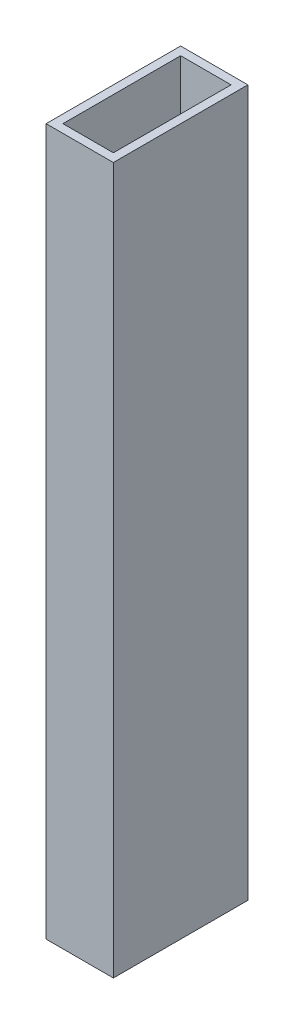
ISO-10303-21;
HEADER;
FILE_DESCRIPTION(('STEP AP214'),'2;1');
FILE_NAME('part.step','',(''),(''),'','','');
FILE_SCHEMA(('AUTOMOTIVE_DESIGN { 1 0 10303 214 1 1 1 1 }'));
ENDSEC;
DATA;
#1=APPLICATION_CONTEXT('core data for automotive mechanical design processes');
#2=APPLICATION_PROTOCOL_DEFINITION('international standard','automotive_design',2000,#1);
#3=PRODUCT_CONTEXT('',#1,'mechanical');
#4=PRODUCT('Part','Part','',(#3));
#5=PRODUCT_RELATED_PRODUCT_CATEGORY('part','',(#4));
#6=PRODUCT_DEFINITION_FORMATION('','',#4);
#7=PRODUCT_DEFINITION_CONTEXT('part definition',#1,'design');
#8=PRODUCT_DEFINITION('design','',#6,#7);
#9=PRODUCT_DEFINITION_SHAPE('','',#8);
#10=(LENGTH_UNIT() NAMED_UNIT(*) SI_UNIT(.MILLI.,.METRE.));
#11=(NAMED_UNIT(*) PLANE_ANGLE_UNIT() SI_UNIT($,.RADIAN.));
#12=(NAMED_UNIT(*) SI_UNIT($,.STERADIAN.) SOLID_ANGLE_UNIT());
#13=UNCERTAINTY_MEASURE_WITH_UNIT(LENGTH_MEASURE(1.E-05),#10,'distance_accuracy_value','');
#14=(GEOMETRIC_REPRESENTATION_CONTEXT(3) GLOBAL_UNCERTAINTY_ASSIGNED_CONTEXT((#13)) GLOBAL_UNIT_ASSIGNED_CONTEXT((#10,
#11,#12)) REPRESENTATION_CONTEXT('',''));
#15=CARTESIAN_POINT('',(0.,0.,0.));
#16=DIRECTION('',(0.,0.,1.));
#17=DIRECTION('',(1.,0.,0.));
#18=AXIS2_PLACEMENT_3D('',#15,#16,#17);
#19=CARTESIAN_POINT('',(0.,266.7,0.));
#20=DIRECTION('',(0.,-1.,0.));
#21=DIRECTION('',(0.,0.,-1.));
#22=AXIS2_PLACEMENT_3D('',#19,#20,#21);
#23=PLANE('',#22);
#24=DIRECTION('',(0.,0.,-1.));
#25=VECTOR('',#24,1.);
#26=CARTESIAN_POINT('',(12.7,266.7,25.4));
#27=LINE('',#26,#25);
#28=CARTESIAN_POINT('',(12.7,266.7,25.4));
#29=VERTEX_POINT('',#28);
#30=CARTESIAN_POINT('',(12.7,266.7,-25.4));
#31=VERTEX_POINT('',#30);
#32=EDGE_CURVE('E159',#29,#31,#27,.T.);
#33=ORIENTED_EDGE('',*,*,#32,.T.);
#34=DIRECTION('',(-1.,0.,0.));
#35=VECTOR('',#34,1.);
#36=CARTESIAN_POINT('',(-12.7,266.7,-25.4));
#37=LINE('',#36,#35);
#38=CARTESIAN_POINT('',(-12.7,266.7,-25.4));
#39=VERTEX_POINT('',#38);
#40=EDGE_CURVE('E163',#31,#39,#37,.T.);
#41=ORIENTED_EDGE('',*,*,#40,.T.);
#42=DIRECTION('',(0.,0.,1.));
#43=VECTOR('',#42,1.);
#44=CARTESIAN_POINT('',(-12.7,266.7,25.4));
#45=LINE('',#44,#43);
#46=CARTESIAN_POINT('',(-12.7,266.7,25.4));
#47=VERTEX_POINT('',#46);
#48=EDGE_CURVE('E167',#39,#47,#45,.T.);
#49=ORIENTED_EDGE('',*,*,#48,.T.);
#50=DIRECTION('',(1.,0.,0.));
#51=VECTOR('',#50,1.);
#52=CARTESIAN_POINT('',(-12.7,266.7,25.4));
#53=LINE('',#52,#51);
#54=EDGE_CURVE('E170',#47,#29,#53,.T.);
#55=ORIENTED_EDGE('',*,*,#54,.T.);
#56=EDGE_LOOP('',(#33,#41,#49,#55));
#57=FACE_BOUND('',#56,.T.);
#58=DIRECTION('',(0.,0.,1.));
#59=VECTOR('',#58,1.);
#60=CARTESIAN_POINT('',(-9.52499999999999,266.7,22.225));
#61=LINE('',#60,#59);
#62=CARTESIAN_POINT('',(-9.52499999999999,266.7,-22.225));
#63=VERTEX_POINT('',#62);
#64=CARTESIAN_POINT('',(-9.52499999999999,266.7,22.225));
#65=VERTEX_POINT('',#64);
#66=EDGE_CURVE('E111',#63,#65,#61,.T.);
#67=ORIENTED_EDGE('',*,*,#66,.F.);
#68=DIRECTION('',(-1.,0.,0.));
#69=VECTOR('',#68,1.);
#70=CARTESIAN_POINT('',(-9.52499999999999,266.7,-22.225));
#71=LINE('',#70,#69);
#72=CARTESIAN_POINT('',(9.52500000000001,266.7,-22.225));
#73=VERTEX_POINT('',#72);
#74=EDGE_CURVE('E137',#73,#63,#71,.T.);
#75=ORIENTED_EDGE('',*,*,#74,.F.);
#76=DIRECTION('',(0.,0.,-1.));
#77=VECTOR('',#76,1.);
#78=CARTESIAN_POINT('',(9.52500000000001,266.7,22.225));
#79=LINE('',#78,#77);
#80=CARTESIAN_POINT('',(9.52500000000001,266.7,22.225));
#81=VERTEX_POINT('',#80);
#82=EDGE_CURVE('E133',#81,#73,#79,.T.);
#83=ORIENTED_EDGE('',*,*,#82,.F.);
#84=DIRECTION('',(1.,0.,0.));
#85=VECTOR('',#84,1.);
#86=CARTESIAN_POINT('',(-9.52499999999999,266.7,22.225));
#87=LINE('',#86,#85);
#88=EDGE_CURVE('E120',#65,#81,#87,.T.);
#89=ORIENTED_EDGE('',*,*,#88,.F.);
#90=EDGE_LOOP('',(#67,#75,#83,#89));
#91=FACE_BOUND('',#90,.T.);
#92=ADVANCED_FACE('F45',(#57,#91),#23,.F.);
#93=CARTESIAN_POINT('',(0.,0.,0.));
#94=DIRECTION('',(0.,-1.,0.));
#95=DIRECTION('',(0.,0.,-1.));
#96=AXIS2_PLACEMENT_3D('',#93,#94,#95);
#97=PLANE('',#96);
#98=DIRECTION('',(0.,0.,-1.));
#99=VECTOR('',#98,1.);
#100=CARTESIAN_POINT('',(12.7,0.,25.4));
#101=LINE('',#100,#99);
#102=CARTESIAN_POINT('',(12.7,0.,25.4));
#103=VERTEX_POINT('',#102);
#104=CARTESIAN_POINT('',(12.7,0.,-25.4));
#105=VERTEX_POINT('',#104);
#106=EDGE_CURVE('E129',#103,#105,#101,.T.);
#107=ORIENTED_EDGE('',*,*,#106,.F.);
#108=DIRECTION('',(1.,0.,0.));
#109=VECTOR('',#108,1.);
#110=CARTESIAN_POINT('',(-12.7,0.,25.4));
#111=LINE('',#110,#109);
#112=CARTESIAN_POINT('',(-12.7,0.,25.4));
#113=VERTEX_POINT('',#112);
#114=EDGE_CURVE('E164',#113,#103,#111,.T.);
#115=ORIENTED_EDGE('',*,*,#114,.F.);
#116=DIRECTION('',(0.,0.,1.));
#117=VECTOR('',#116,1.);
#118=CARTESIAN_POINT('',(-12.7,0.,25.4));
#119=LINE('',#118,#117);
#120=CARTESIAN_POINT('',(-12.7,0.,-25.4));
#121=VERTEX_POINT('',#120);
#122=EDGE_CURVE('E180',#121,#113,#119,.T.);
#123=ORIENTED_EDGE('',*,*,#122,.F.);
#124=DIRECTION('',(-1.,0.,0.));
#125=VECTOR('',#124,1.);
#126=CARTESIAN_POINT('',(-12.7,0.,-25.4));
#127=LINE('',#126,#125);
#128=EDGE_CURVE('E177',#105,#121,#127,.T.);
#129=ORIENTED_EDGE('',*,*,#128,.F.);
#130=EDGE_LOOP('',(#107,#115,#123,#129));
#131=FACE_BOUND('',#130,.T.);
#132=DIRECTION('',(-1.,0.,0.));
#133=VECTOR('',#132,1.);
#134=CARTESIAN_POINT('',(-9.52499999999999,0.,-22.225));
#135=LINE('',#134,#133);
#136=CARTESIAN_POINT('',(9.52500000000001,0.,-22.225));
#137=VERTEX_POINT('',#136);
#138=CARTESIAN_POINT('',(-9.52499999999999,0.,-22.225));
#139=VERTEX_POINT('',#138);
#140=EDGE_CURVE('E121',#137,#139,#135,.T.);
#141=ORIENTED_EDGE('',*,*,#140,.T.);
#142=DIRECTION('',(0.,0.,1.));
#143=VECTOR('',#142,1.);
#144=CARTESIAN_POINT('',(-9.52499999999999,0.,22.225));
#145=LINE('',#144,#143);
#146=CARTESIAN_POINT('',(-9.52499999999999,0.,22.225));
#147=VERTEX_POINT('',#146);
#148=EDGE_CURVE('E69',#139,#147,#145,.T.);
#149=ORIENTED_EDGE('',*,*,#148,.T.);
#150=DIRECTION('',(1.,0.,0.));
#151=VECTOR('',#150,1.);
#152=CARTESIAN_POINT('',(-9.52499999999999,0.,22.225));
#153=LINE('',#152,#151);
#154=CARTESIAN_POINT('',(9.52500000000001,0.,22.225));
#155=VERTEX_POINT('',#154);
#156=EDGE_CURVE('E127',#147,#155,#153,.T.);
#157=ORIENTED_EDGE('',*,*,#156,.T.);
#158=DIRECTION('',(0.,0.,-1.));
#159=VECTOR('',#158,1.);
#160=CARTESIAN_POINT('',(9.52500000000001,0.,22.225));
#161=LINE('',#160,#159);
#162=EDGE_CURVE('E146',#155,#137,#161,.T.);
#163=ORIENTED_EDGE('',*,*,#162,.T.);
#164=EDGE_LOOP('',(#141,#149,#157,#163));
#165=FACE_BOUND('',#164,.T.);
#166=ADVANCED_FACE('F203',(#131,#165),#97,.T.);
#167=CARTESIAN_POINT('',(12.7,266.7,25.4));
#168=DIRECTION('',(-1.,0.,0.));
#169=DIRECTION('',(0.,0.,1.));
#170=AXIS2_PLACEMENT_3D('',#167,#168,#169);
#171=PLANE('',#170);
#172=ORIENTED_EDGE('',*,*,#106,.T.);
#173=DIRECTION('',(0.,-1.,0.));
#174=VECTOR('',#173,1.);
#175=CARTESIAN_POINT('',(12.7,266.7,-25.4));
#176=LINE('',#175,#174);
#177=EDGE_CURVE('E11',#31,#105,#176,.T.);
#178=ORIENTED_EDGE('',*,*,#177,.F.);
#179=ORIENTED_EDGE('',*,*,#32,.F.);
#180=DIRECTION('',(0.,-1.,0.));
#181=VECTOR('',#180,1.);
#182=CARTESIAN_POINT('',(12.7,266.7,25.4));
#183=LINE('',#182,#181);
#184=EDGE_CURVE('E173',#29,#103,#183,.T.);
#185=ORIENTED_EDGE('',*,*,#184,.T.);
#186=EDGE_LOOP('',(#172,#178,#179,#185));
#187=FACE_BOUND('',#186,.T.);
#188=ADVANCED_FACE('F47',(#187),#171,.F.);
#189=CARTESIAN_POINT('',(-12.7,266.7,-25.4));
#190=DIRECTION('',(0.,0.,1.));
#191=DIRECTION('',(1.,0.,0.));
#192=AXIS2_PLACEMENT_3D('',#189,#190,#191);
#193=PLANE('',#192);
#194=ORIENTED_EDGE('',*,*,#128,.T.);
#195=DIRECTION('',(0.,-1.,0.));
#196=VECTOR('',#195,1.);
#197=CARTESIAN_POINT('',(-12.7,266.7,-25.4));
#198=LINE('',#197,#196);
#199=EDGE_CURVE('E54',#39,#121,#198,.T.);
#200=ORIENTED_EDGE('',*,*,#199,.F.);
#201=ORIENTED_EDGE('',*,*,#40,.F.);
#202=ORIENTED_EDGE('',*,*,#177,.T.);
#203=EDGE_LOOP('',(#194,#200,#201,#202));
#204=FACE_BOUND('',#203,.T.);
#205=ADVANCED_FACE('F213',(#204),#193,.F.);
#206=CARTESIAN_POINT('',(-12.7,266.7,25.4));
#207=DIRECTION('',(1.,0.,0.));
#208=DIRECTION('',(0.,0.,-1.));
#209=AXIS2_PLACEMENT_3D('',#206,#207,#208);
#210=PLANE('',#209);
#211=ORIENTED_EDGE('',*,*,#122,.T.);
#212=DIRECTION('',(0.,-1.,0.));
#213=VECTOR('',#212,1.);
#214=CARTESIAN_POINT('',(-12.7,266.7,25.4));
#215=LINE('',#214,#213);
#216=EDGE_CURVE('E188',#47,#113,#215,.T.);
#217=ORIENTED_EDGE('',*,*,#216,.F.);
#218=ORIENTED_EDGE('',*,*,#48,.F.);
#219=ORIENTED_EDGE('',*,*,#199,.T.);
#220=EDGE_LOOP('',(#211,#217,#218,#219));
#221=FACE_BOUND('',#220,.T.);
#222=ADVANCED_FACE('F197',(#221),#210,.F.);
#223=CARTESIAN_POINT('',(-12.7,266.7,25.4));
#224=DIRECTION('',(0.,0.,-1.));
#225=DIRECTION('',(-1.,0.,0.));
#226=AXIS2_PLACEMENT_3D('',#223,#224,#225);
#227=PLANE('',#226);
#228=ORIENTED_EDGE('',*,*,#114,.T.);
#229=ORIENTED_EDGE('',*,*,#184,.F.);
#230=ORIENTED_EDGE('',*,*,#54,.F.);
#231=ORIENTED_EDGE('',*,*,#216,.T.);
#232=EDGE_LOOP('',(#228,#229,#230,#231));
#233=FACE_BOUND('',#232,.T.);
#234=ADVANCED_FACE('F207',(#233),#227,.F.);
#235=CARTESIAN_POINT('',(-9.52499999999999,266.7,22.225));
#236=DIRECTION('',(1.,0.,0.));
#237=DIRECTION('',(0.,0.,-1.));
#238=AXIS2_PLACEMENT_3D('',#235,#236,#237);
#239=PLANE('',#238);
#240=ORIENTED_EDGE('',*,*,#148,.F.);
#241=DIRECTION('',(0.,-1.,0.));
#242=VECTOR('',#241,1.);
#243=CARTESIAN_POINT('',(-9.52499999999999,266.7,-22.225));
#244=LINE('',#243,#242);
#245=EDGE_CURVE('E115',#63,#139,#244,.T.);
#246=ORIENTED_EDGE('',*,*,#245,.F.);
#247=ORIENTED_EDGE('',*,*,#66,.T.);
#248=DIRECTION('',(0.,-1.,0.));
#249=VECTOR('',#248,1.);
#250=CARTESIAN_POINT('',(-9.52499999999999,266.7,22.225));
#251=LINE('',#250,#249);
#252=EDGE_CURVE('E114',#65,#147,#251,.T.);
#253=ORIENTED_EDGE('',*,*,#252,.T.);
#254=EDGE_LOOP('',(#240,#246,#247,#253));
#255=FACE_BOUND('',#254,.T.);
#256=ADVANCED_FACE('F113',(#255),#239,.T.);
#257=CARTESIAN_POINT('',(-9.52499999999999,266.7,22.225));
#258=DIRECTION('',(0.,0.,-1.));
#259=DIRECTION('',(-1.,0.,0.));
#260=AXIS2_PLACEMENT_3D('',#257,#258,#259);
#261=PLANE('',#260);
#262=ORIENTED_EDGE('',*,*,#156,.F.);
#263=ORIENTED_EDGE('',*,*,#252,.F.);
#264=ORIENTED_EDGE('',*,*,#88,.T.);
#265=DIRECTION('',(0.,-1.,0.));
#266=VECTOR('',#265,1.);
#267=CARTESIAN_POINT('',(9.52500000000001,266.7,22.225));
#268=LINE('',#267,#266);
#269=EDGE_CURVE('E130',#81,#155,#268,.T.);
#270=ORIENTED_EDGE('',*,*,#269,.T.);
#271=EDGE_LOOP('',(#262,#263,#264,#270));
#272=FACE_BOUND('',#271,.T.);
#273=ADVANCED_FACE('F124',(#272),#261,.T.);
#274=CARTESIAN_POINT('',(9.52500000000001,266.7,22.225));
#275=DIRECTION('',(-1.,0.,0.));
#276=DIRECTION('',(0.,0.,1.));
#277=AXIS2_PLACEMENT_3D('',#274,#275,#276);
#278=PLANE('',#277);
#279=ORIENTED_EDGE('',*,*,#162,.F.);
#280=ORIENTED_EDGE('',*,*,#269,.F.);
#281=ORIENTED_EDGE('',*,*,#82,.T.);
#282=DIRECTION('',(0.,-1.,0.));
#283=VECTOR('',#282,1.);
#284=CARTESIAN_POINT('',(9.52500000000001,266.7,-22.225));
#285=LINE('',#284,#283);
#286=EDGE_CURVE('E61',#73,#137,#285,.T.);
#287=ORIENTED_EDGE('',*,*,#286,.T.);
#288=EDGE_LOOP('',(#279,#280,#281,#287));
#289=FACE_BOUND('',#288,.T.);
#290=ADVANCED_FACE('F236',(#289),#278,.T.);
#291=CARTESIAN_POINT('',(-9.52499999999999,266.7,-22.225));
#292=DIRECTION('',(0.,0.,1.));
#293=DIRECTION('',(1.,0.,0.));
#294=AXIS2_PLACEMENT_3D('',#291,#292,#293);
#295=PLANE('',#294);
#296=ORIENTED_EDGE('',*,*,#140,.F.);
#297=ORIENTED_EDGE('',*,*,#286,.F.);
#298=ORIENTED_EDGE('',*,*,#74,.T.);
#299=ORIENTED_EDGE('',*,*,#245,.T.);
#300=EDGE_LOOP('',(#296,#297,#298,#299));
#301=FACE_BOUND('',#300,.T.);
#302=ADVANCED_FACE('F240',(#301),#295,.T.);
#303=CLOSED_SHELL('',(#92,#166,#188,#205,#222,#234,#256,#273,#290,#302));
#304=MANIFOLD_SOLID_BREP('B2',#303);
#305=ADVANCED_BREP_SHAPE_REPRESENTATION('',(#18,#304),#14);
#306=SHAPE_DEFINITION_REPRESENTATION(#9,#305);
ENDSEC;
END-ISO-10303-21;
